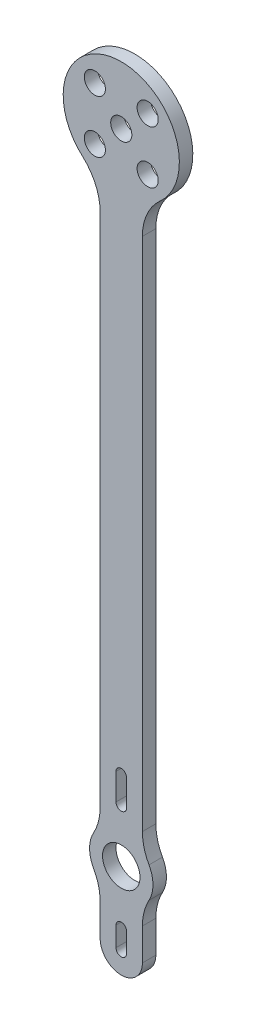
ISO-10303-21;
HEADER;
FILE_DESCRIPTION(('STEP AP214'),'2;1');
FILE_NAME('part.step','',(''),(''),'','','');
FILE_SCHEMA(('AUTOMOTIVE_DESIGN { 1 0 10303 214 1 1 1 1 }'));
ENDSEC;
DATA;
#1=APPLICATION_CONTEXT('core data for automotive mechanical design processes');
#2=APPLICATION_PROTOCOL_DEFINITION('international standard','automotive_design',2000,#1);
#3=PRODUCT_CONTEXT('',#1,'mechanical');
#4=PRODUCT('Part','Part','',(#3));
#5=PRODUCT_RELATED_PRODUCT_CATEGORY('part','',(#4));
#6=PRODUCT_DEFINITION_FORMATION('','',#4);
#7=PRODUCT_DEFINITION_CONTEXT('part definition',#1,'design');
#8=PRODUCT_DEFINITION('design','',#6,#7);
#9=PRODUCT_DEFINITION_SHAPE('','',#8);
#10=(LENGTH_UNIT() NAMED_UNIT(*) SI_UNIT(.MILLI.,.METRE.));
#11=(NAMED_UNIT(*) PLANE_ANGLE_UNIT() SI_UNIT($,.RADIAN.));
#12=(NAMED_UNIT(*) SI_UNIT($,.STERADIAN.) SOLID_ANGLE_UNIT());
#13=UNCERTAINTY_MEASURE_WITH_UNIT(LENGTH_MEASURE(1.E-05),#10,'distance_accuracy_value','');
#14=(GEOMETRIC_REPRESENTATION_CONTEXT(3) GLOBAL_UNCERTAINTY_ASSIGNED_CONTEXT((#13)) GLOBAL_UNIT_ASSIGNED_CONTEXT((#10,
#11,#12)) REPRESENTATION_CONTEXT('',''));
#15=CARTESIAN_POINT('',(0.,0.,0.));
#16=DIRECTION('',(0.,0.,1.));
#17=DIRECTION('',(1.,0.,0.));
#18=AXIS2_PLACEMENT_3D('',#15,#16,#17);
#19=CARTESIAN_POINT('',(0.,-13.8,2.55));
#20=DIRECTION('',(0.,0.,1.));
#21=DIRECTION('',(1.,0.,0.));
#22=AXIS2_PLACEMENT_3D('',#19,#20,#21);
#23=PLANE('',#22);
#24=CARTESIAN_POINT('',(5.0000000000001,116.,2.55));
#25=DIRECTION('',(0.,0.,1.));
#26=DIRECTION('',(1.,0.,0.));
#27=AXIS2_PLACEMENT_3D('',#24,#25,#26);
#28=CIRCLE('',#27,2.);
#29=CARTESIAN_POINT('',(7.00000000000011,116.,2.55));
#30=VERTEX_POINT('',#29);
#31=EDGE_CURVE('E713',#30,#30,#28,.T.);
#32=ORIENTED_EDGE('',*,*,#31,.F.);
#33=EDGE_LOOP('',(#32));
#34=FACE_BOUND('',#33,.T.);
#35=DIRECTION('',(0.,-1.,0.));
#36=VECTOR('',#35,1.);
#37=CARTESIAN_POINT('',(-0.999999999999998,15.1,2.55));
#38=LINE('',#37,#36);
#39=CARTESIAN_POINT('',(-0.999999999999998,15.1,2.55));
#40=VERTEX_POINT('',#39);
#41=CARTESIAN_POINT('',(-0.999999999999998,10.1,2.55));
#42=VERTEX_POINT('',#41);
#43=EDGE_CURVE('E192',#40,#42,#38,.T.);
#44=ORIENTED_EDGE('',*,*,#43,.F.);
#45=CARTESIAN_POINT('',(0.,15.1,2.55));
#46=DIRECTION('',(0.,0.,1.));
#47=DIRECTION('',(1.,0.,0.));
#48=AXIS2_PLACEMENT_3D('',#45,#46,#47);
#49=CIRCLE('',#48,0.999999999999998);
#50=CARTESIAN_POINT('',(0.999999999999998,15.1,2.55));
#51=VERTEX_POINT('',#50);
#52=EDGE_CURVE('E184',#51,#40,#49,.T.);
#53=ORIENTED_EDGE('',*,*,#52,.F.);
#54=DIRECTION('',(0.,1.,0.));
#55=VECTOR('',#54,1.);
#56=CARTESIAN_POINT('',(0.999999999999998,15.1,2.55));
#57=LINE('',#56,#55);
#58=CARTESIAN_POINT('',(0.999999999999998,10.1,2.55));
#59=VERTEX_POINT('',#58);
#60=EDGE_CURVE('E207',#59,#51,#57,.T.);
#61=ORIENTED_EDGE('',*,*,#60,.F.);
#62=CARTESIAN_POINT('',(0.,10.1,2.55));
#63=DIRECTION('',(0.,0.,1.));
#64=DIRECTION('',(1.,0.,0.));
#65=AXIS2_PLACEMENT_3D('',#62,#63,#64);
#66=CIRCLE('',#65,0.999999999999998);
#67=EDGE_CURVE('E205',#42,#59,#66,.T.);
#68=ORIENTED_EDGE('',*,*,#67,.F.);
#69=EDGE_LOOP('',(#44,#53,#61,#68));
#70=FACE_BOUND('',#69,.T.);
#71=CARTESIAN_POINT('',(-5.,126.,2.55));
#72=DIRECTION('',(0.,0.,1.));
#73=DIRECTION('',(1.,0.,0.));
#74=AXIS2_PLACEMENT_3D('',#71,#72,#73);
#75=CIRCLE('',#74,2.);
#76=CARTESIAN_POINT('',(-3.,126.,2.55));
#77=VERTEX_POINT('',#76);
#78=EDGE_CURVE('E254',#77,#77,#75,.T.);
#79=ORIENTED_EDGE('',*,*,#78,.F.);
#80=EDGE_LOOP('',(#79));
#81=FACE_BOUND('',#80,.T.);
#82=CARTESIAN_POINT('',(0.,0.,2.55));
#83=DIRECTION('',(0.,0.,1.));
#84=DIRECTION('',(1.,0.,0.));
#85=AXIS2_PLACEMENT_3D('',#82,#83,#84);
#86=CIRCLE('',#85,3.55);
#87=CARTESIAN_POINT('',(3.55,0.,2.55));
#88=VERTEX_POINT('',#87);
#89=EDGE_CURVE('E266',#88,#88,#86,.T.);
#90=ORIENTED_EDGE('',*,*,#89,.F.);
#91=EDGE_LOOP('',(#90));
#92=FACE_BOUND('',#91,.T.);
#93=CARTESIAN_POINT('',(0.,-13.8,2.55));
#94=DIRECTION('',(0.,0.,1.));
#95=DIRECTION('',(1.,0.,0.));
#96=AXIS2_PLACEMENT_3D('',#93,#94,#95);
#97=CIRCLE('',#96,4.);
#98=CARTESIAN_POINT('',(-4.,-13.8,2.55));
#99=VERTEX_POINT('',#98);
#100=CARTESIAN_POINT('',(4.,-13.8,2.55));
#101=VERTEX_POINT('',#100);
#102=EDGE_CURVE('E272',#99,#101,#97,.T.);
#103=ORIENTED_EDGE('',*,*,#102,.T.);
#104=DIRECTION('',(0.,1.,0.));
#105=VECTOR('',#104,1.);
#106=CARTESIAN_POINT('',(4.,-7.74596669241483,2.55));
#107=LINE('',#106,#105);
#108=CARTESIAN_POINT('',(4.,-7.74596669241483,2.55));
#109=VERTEX_POINT('',#108);
#110=EDGE_CURVE('E275',#101,#109,#107,.T.);
#111=ORIENTED_EDGE('',*,*,#110,.T.);
#112=CARTESIAN_POINT('',(14.,-7.74596669241483,2.55));
#113=DIRECTION('',(0.,0.,-1.));
#114=DIRECTION('',(1.,0.,0.));
#115=AXIS2_PLACEMENT_3D('',#112,#113,#114);
#116=CIRCLE('',#115,10.);
#117=CARTESIAN_POINT('',(5.25,-2.90473750965556,2.55));
#118=VERTEX_POINT('',#117);
#119=EDGE_CURVE('E278',#109,#118,#116,.T.);
#120=ORIENTED_EDGE('',*,*,#119,.T.);
#121=CARTESIAN_POINT('',(0.,0.,2.55));
#122=DIRECTION('',(0.,0.,1.));
#123=DIRECTION('',(1.,0.,0.));
#124=AXIS2_PLACEMENT_3D('',#121,#122,#123);
#125=CIRCLE('',#124,6.);
#126=CARTESIAN_POINT('',(5.25,2.90473750965556,2.55));
#127=VERTEX_POINT('',#126);
#128=EDGE_CURVE('E280',#118,#127,#125,.T.);
#129=ORIENTED_EDGE('',*,*,#128,.T.);
#130=CARTESIAN_POINT('',(14.,7.74596669241483,2.55));
#131=DIRECTION('',(0.,0.,-1.));
#132=DIRECTION('',(1.,0.,0.));
#133=AXIS2_PLACEMENT_3D('',#130,#131,#132);
#134=CIRCLE('',#133,10.);
#135=CARTESIAN_POINT('',(4.,7.74596669241483,2.55));
#136=VERTEX_POINT('',#135);
#137=EDGE_CURVE('E282',#127,#136,#134,.T.);
#138=ORIENTED_EDGE('',*,*,#137,.T.);
#139=DIRECTION('',(0.,1.,0.));
#140=VECTOR('',#139,1.);
#141=CARTESIAN_POINT('',(3.99999999999999,105.347524157501,2.55));
#142=LINE('',#141,#140);
#143=CARTESIAN_POINT('',(3.99999999999999,105.347524157501,2.55));
#144=VERTEX_POINT('',#143);
#145=EDGE_CURVE('E284',#136,#144,#142,.T.);
#146=ORIENTED_EDGE('',*,*,#145,.T.);
#147=CARTESIAN_POINT('',(14.,105.347524157501,2.55));
#148=DIRECTION('',(0.,0.,-1.));
#149=DIRECTION('',(-1.,0.,0.));
#150=AXIS2_PLACEMENT_3D('',#147,#148,#149);
#151=CIRCLE('',#150,10.);
#152=CARTESIAN_POINT('',(7.33333333333333,112.801084082501,2.55));
#153=VERTEX_POINT('',#152);
#154=EDGE_CURVE('E286',#144,#153,#151,.T.);
#155=ORIENTED_EDGE('',*,*,#154,.T.);
#156=CARTESIAN_POINT('',(0.,121.,2.55));
#157=DIRECTION('',(0.,0.,1.));
#158=DIRECTION('',(1.,0.,0.));
#159=AXIS2_PLACEMENT_3D('',#156,#157,#158);
#160=CIRCLE('',#159,11.);
#161=CARTESIAN_POINT('',(-7.33333333333335,112.801084082501,2.55));
#162=VERTEX_POINT('',#161);
#163=EDGE_CURVE('E288',#153,#162,#160,.T.);
#164=ORIENTED_EDGE('',*,*,#163,.T.);
#165=CARTESIAN_POINT('',(-14.,105.347524157501,2.55));
#166=DIRECTION('',(0.,0.,-1.));
#167=DIRECTION('',(1.,0.,0.));
#168=AXIS2_PLACEMENT_3D('',#165,#166,#167);
#169=CIRCLE('',#168,10.);
#170=CARTESIAN_POINT('',(-4.00000000000001,105.347524157501,2.55));
#171=VERTEX_POINT('',#170);
#172=EDGE_CURVE('E290',#162,#171,#169,.T.);
#173=ORIENTED_EDGE('',*,*,#172,.T.);
#174=DIRECTION('',(0.,-1.,0.));
#175=VECTOR('',#174,1.);
#176=CARTESIAN_POINT('',(-4.00000000000001,105.347524157501,2.55));
#177=LINE('',#176,#175);
#178=CARTESIAN_POINT('',(-4.,7.74596669241484,2.55));
#179=VERTEX_POINT('',#178);
#180=EDGE_CURVE('E292',#171,#179,#177,.T.);
#181=ORIENTED_EDGE('',*,*,#180,.T.);
#182=CARTESIAN_POINT('',(-14.,7.74596669241484,2.55));
#183=DIRECTION('',(0.,0.,-1.));
#184=DIRECTION('',(1.,0.,0.));
#185=AXIS2_PLACEMENT_3D('',#182,#183,#184);
#186=CIRCLE('',#185,10.);
#187=CARTESIAN_POINT('',(-5.25,2.90473750965556,2.55));
#188=VERTEX_POINT('',#187);
#189=EDGE_CURVE('E294',#179,#188,#186,.T.);
#190=ORIENTED_EDGE('',*,*,#189,.T.);
#191=CARTESIAN_POINT('',(0.,0.,2.55));
#192=DIRECTION('',(0.,0.,1.));
#193=DIRECTION('',(1.,0.,0.));
#194=AXIS2_PLACEMENT_3D('',#191,#192,#193);
#195=CIRCLE('',#194,6.);
#196=CARTESIAN_POINT('',(-5.25,-2.90473750965556,2.55));
#197=VERTEX_POINT('',#196);
#198=EDGE_CURVE('E296',#188,#197,#195,.T.);
#199=ORIENTED_EDGE('',*,*,#198,.T.);
#200=CARTESIAN_POINT('',(-14.,-7.74596669241484,2.55));
#201=DIRECTION('',(0.,0.,-1.));
#202=DIRECTION('',(-1.,0.,0.));
#203=AXIS2_PLACEMENT_3D('',#200,#201,#202);
#204=CIRCLE('',#203,10.);
#205=CARTESIAN_POINT('',(-4.,-7.74596669241484,2.55));
#206=VERTEX_POINT('',#205);
#207=EDGE_CURVE('E298',#197,#206,#204,.T.);
#208=ORIENTED_EDGE('',*,*,#207,.T.);
#209=DIRECTION('',(0.,-1.,0.));
#210=VECTOR('',#209,1.);
#211=CARTESIAN_POINT('',(-4.,-7.74596669241484,2.55));
#212=LINE('',#211,#210);
#213=EDGE_CURVE('E300',#206,#99,#212,.T.);
#214=ORIENTED_EDGE('',*,*,#213,.T.);
#215=EDGE_LOOP('',(#103,#111,#120,#129,#138,#146,#155,#164,#173,#181,#190,#199,#208,#214));
#216=FACE_BOUND('',#215,.T.);
#217=CARTESIAN_POINT('',(0.,121.,2.55));
#218=DIRECTION('',(0.,0.,1.));
#219=DIRECTION('',(1.,0.,0.));
#220=AXIS2_PLACEMENT_3D('',#217,#218,#219);
#221=CIRCLE('',#220,2.);
#222=CARTESIAN_POINT('',(2.,121.,2.55));
#223=VERTEX_POINT('',#222);
#224=EDGE_CURVE('E260',#223,#223,#221,.T.);
#225=ORIENTED_EDGE('',*,*,#224,.F.);
#226=EDGE_LOOP('',(#225));
#227=FACE_BOUND('',#226,.T.);
#228=DIRECTION('',(0.,-1.,0.));
#229=VECTOR('',#228,1.);
#230=CARTESIAN_POINT('',(-0.999999999999998,-10.1,2.55));
#231=LINE('',#230,#229);
#232=CARTESIAN_POINT('',(-0.999999999999998,-10.1,2.55));
#233=VERTEX_POINT('',#232);
#234=CARTESIAN_POINT('',(-0.999999999999998,-13.8,2.55));
#235=VERTEX_POINT('',#234);
#236=EDGE_CURVE('E225',#233,#235,#231,.T.);
#237=ORIENTED_EDGE('',*,*,#236,.F.);
#238=CARTESIAN_POINT('',(0.,-10.1,2.55));
#239=DIRECTION('',(0.,0.,1.));
#240=DIRECTION('',(1.,0.,0.));
#241=AXIS2_PLACEMENT_3D('',#238,#239,#240);
#242=CIRCLE('',#241,0.999999999999998);
#243=CARTESIAN_POINT('',(0.999999999999998,-10.1,2.55));
#244=VERTEX_POINT('',#243);
#245=EDGE_CURVE('E223',#244,#233,#242,.T.);
#246=ORIENTED_EDGE('',*,*,#245,.F.);
#247=DIRECTION('',(0.,1.,0.));
#248=VECTOR('',#247,1.);
#249=CARTESIAN_POINT('',(0.999999999999998,-10.1,2.55));
#250=LINE('',#249,#248);
#251=CARTESIAN_POINT('',(0.999999999999998,-13.8,2.55));
#252=VERTEX_POINT('',#251);
#253=EDGE_CURVE('E231',#252,#244,#250,.T.);
#254=ORIENTED_EDGE('',*,*,#253,.F.);
#255=CARTESIAN_POINT('',(0.,-13.8,2.55));
#256=DIRECTION('',(0.,0.,1.));
#257=DIRECTION('',(1.,0.,0.));
#258=AXIS2_PLACEMENT_3D('',#255,#256,#257);
#259=CIRCLE('',#258,0.999999999999998);
#260=EDGE_CURVE('E228',#235,#252,#259,.T.);
#261=ORIENTED_EDGE('',*,*,#260,.F.);
#262=EDGE_LOOP('',(#237,#246,#254,#261));
#263=FACE_BOUND('',#262,.T.);
#264=CARTESIAN_POINT('',(5.,126.,2.55));
#265=DIRECTION('',(0.,0.,1.));
#266=DIRECTION('',(1.,0.,0.));
#267=AXIS2_PLACEMENT_3D('',#264,#265,#266);
#268=CIRCLE('',#267,2.);
#269=CARTESIAN_POINT('',(7.,126.,2.55));
#270=VERTEX_POINT('',#269);
#271=EDGE_CURVE('E213',#270,#270,#268,.T.);
#272=ORIENTED_EDGE('',*,*,#271,.F.);
#273=EDGE_LOOP('',(#272));
#274=FACE_BOUND('',#273,.T.);
#275=CARTESIAN_POINT('',(-4.9999999999999,116.,2.55));
#276=DIRECTION('',(0.,0.,1.));
#277=DIRECTION('',(1.,0.,0.));
#278=AXIS2_PLACEMENT_3D('',#275,#276,#277);
#279=CIRCLE('',#278,2.);
#280=CARTESIAN_POINT('',(-2.99999999999989,116.,2.55));
#281=VERTEX_POINT('',#280);
#282=EDGE_CURVE('E704',#281,#281,#279,.T.);
#283=ORIENTED_EDGE('',*,*,#282,.F.);
#284=EDGE_LOOP('',(#283));
#285=FACE_BOUND('',#284,.T.);
#286=ADVANCED_FACE('F35',(#34,#70,#81,#92,#216,#227,#263,#274,#285),#23,.T.);
#287=CARTESIAN_POINT('',(0.,-13.8,0.));
#288=DIRECTION('',(0.,0.,1.));
#289=DIRECTION('',(1.,0.,0.));
#290=AXIS2_PLACEMENT_3D('',#287,#288,#289);
#291=PLANE('',#290);
#292=CARTESIAN_POINT('',(5.0000000000001,116.,0.));
#293=DIRECTION('',(0.,0.,1.));
#294=DIRECTION('',(1.,0.,0.));
#295=AXIS2_PLACEMENT_3D('',#292,#293,#294);
#296=CIRCLE('',#295,2.);
#297=CARTESIAN_POINT('',(7.00000000000011,116.,0.));
#298=VERTEX_POINT('',#297);
#299=EDGE_CURVE('E710',#298,#298,#296,.T.);
#300=ORIENTED_EDGE('',*,*,#299,.T.);
#301=EDGE_LOOP('',(#300));
#302=FACE_BOUND('',#301,.T.);
#303=CARTESIAN_POINT('',(0.,15.1,0.));
#304=DIRECTION('',(0.,0.,1.));
#305=DIRECTION('',(1.,0.,0.));
#306=AXIS2_PLACEMENT_3D('',#303,#304,#305);
#307=CIRCLE('',#306,0.999999999999998);
#308=CARTESIAN_POINT('',(0.999999999999998,15.1,0.));
#309=VERTEX_POINT('',#308);
#310=CARTESIAN_POINT('',(-0.999999999999998,15.1,0.));
#311=VERTEX_POINT('',#310);
#312=EDGE_CURVE('E58',#309,#311,#307,.T.);
#313=ORIENTED_EDGE('',*,*,#312,.T.);
#314=DIRECTION('',(0.,-1.,0.));
#315=VECTOR('',#314,1.);
#316=CARTESIAN_POINT('',(-0.999999999999998,15.1,0.));
#317=LINE('',#316,#315);
#318=CARTESIAN_POINT('',(-0.999999999999998,10.1,0.));
#319=VERTEX_POINT('',#318);
#320=EDGE_CURVE('E199',#311,#319,#317,.T.);
#321=ORIENTED_EDGE('',*,*,#320,.T.);
#322=CARTESIAN_POINT('',(0.,10.1,0.));
#323=DIRECTION('',(0.,0.,1.));
#324=DIRECTION('',(1.,0.,0.));
#325=AXIS2_PLACEMENT_3D('',#322,#323,#324);
#326=CIRCLE('',#325,0.999999999999998);
#327=CARTESIAN_POINT('',(0.999999999999998,10.1,0.));
#328=VERTEX_POINT('',#327);
#329=EDGE_CURVE('E215',#319,#328,#326,.T.);
#330=ORIENTED_EDGE('',*,*,#329,.T.);
#331=DIRECTION('',(0.,1.,0.));
#332=VECTOR('',#331,1.);
#333=CARTESIAN_POINT('',(0.999999999999998,15.1,0.));
#334=LINE('',#333,#332);
#335=EDGE_CURVE('E193',#328,#309,#334,.T.);
#336=ORIENTED_EDGE('',*,*,#335,.T.);
#337=EDGE_LOOP('',(#313,#321,#330,#336));
#338=FACE_BOUND('',#337,.T.);
#339=CARTESIAN_POINT('',(-5.,126.,0.));
#340=DIRECTION('',(0.,0.,1.));
#341=DIRECTION('',(1.,0.,0.));
#342=AXIS2_PLACEMENT_3D('',#339,#340,#341);
#343=CIRCLE('',#342,2.);
#344=CARTESIAN_POINT('',(-3.,126.,0.));
#345=VERTEX_POINT('',#344);
#346=EDGE_CURVE('E253',#345,#345,#343,.T.);
#347=ORIENTED_EDGE('',*,*,#346,.T.);
#348=EDGE_LOOP('',(#347));
#349=FACE_BOUND('',#348,.T.);
#350=CARTESIAN_POINT('',(0.,0.,0.));
#351=DIRECTION('',(0.,0.,1.));
#352=DIRECTION('',(1.,0.,0.));
#353=AXIS2_PLACEMENT_3D('',#350,#351,#352);
#354=CIRCLE('',#353,3.55);
#355=CARTESIAN_POINT('',(3.55,0.,0.));
#356=VERTEX_POINT('',#355);
#357=EDGE_CURVE('E263',#356,#356,#354,.T.);
#358=ORIENTED_EDGE('',*,*,#357,.T.);
#359=EDGE_LOOP('',(#358));
#360=FACE_BOUND('',#359,.T.);
#361=CARTESIAN_POINT('',(0.,-13.8,0.));
#362=DIRECTION('',(0.,0.,1.));
#363=DIRECTION('',(1.,0.,0.));
#364=AXIS2_PLACEMENT_3D('',#361,#362,#363);
#365=CIRCLE('',#364,4.);
#366=CARTESIAN_POINT('',(-4.,-13.8,0.));
#367=VERTEX_POINT('',#366);
#368=CARTESIAN_POINT('',(4.,-13.8,0.));
#369=VERTEX_POINT('',#368);
#370=EDGE_CURVE('E269',#367,#369,#365,.T.);
#371=ORIENTED_EDGE('',*,*,#370,.F.);
#372=DIRECTION('',(0.,-1.,0.));
#373=VECTOR('',#372,1.);
#374=CARTESIAN_POINT('',(-4.,-7.74596669241484,0.));
#375=LINE('',#374,#373);
#376=CARTESIAN_POINT('',(-4.,-7.74596669241484,0.));
#377=VERTEX_POINT('',#376);
#378=EDGE_CURVE('E276',#377,#367,#375,.T.);
#379=ORIENTED_EDGE('',*,*,#378,.F.);
#380=CARTESIAN_POINT('',(-14.,-7.74596669241484,0.));
#381=DIRECTION('',(0.,0.,-1.));
#382=DIRECTION('',(-1.,0.,0.));
#383=AXIS2_PLACEMENT_3D('',#380,#381,#382);
#384=CIRCLE('',#383,10.);
#385=CARTESIAN_POINT('',(-5.25,-2.90473750965556,0.));
#386=VERTEX_POINT('',#385);
#387=EDGE_CURVE('E327',#386,#377,#384,.T.);
#388=ORIENTED_EDGE('',*,*,#387,.F.);
#389=CARTESIAN_POINT('',(0.,0.,0.));
#390=DIRECTION('',(0.,0.,1.));
#391=DIRECTION('',(1.,0.,0.));
#392=AXIS2_PLACEMENT_3D('',#389,#390,#391);
#393=CIRCLE('',#392,6.);
#394=CARTESIAN_POINT('',(-5.25,2.90473750965556,0.));
#395=VERTEX_POINT('',#394);
#396=EDGE_CURVE('E325',#395,#386,#393,.T.);
#397=ORIENTED_EDGE('',*,*,#396,.F.);
#398=CARTESIAN_POINT('',(-14.,7.74596669241484,0.));
#399=DIRECTION('',(0.,0.,-1.));
#400=DIRECTION('',(1.,0.,0.));
#401=AXIS2_PLACEMENT_3D('',#398,#399,#400);
#402=CIRCLE('',#401,10.);
#403=CARTESIAN_POINT('',(-4.,7.74596669241484,0.));
#404=VERTEX_POINT('',#403);
#405=EDGE_CURVE('E323',#404,#395,#402,.T.);
#406=ORIENTED_EDGE('',*,*,#405,.F.);
#407=DIRECTION('',(0.,-1.,0.));
#408=VECTOR('',#407,1.);
#409=CARTESIAN_POINT('',(-4.00000000000001,105.347524157501,0.));
#410=LINE('',#409,#408);
#411=CARTESIAN_POINT('',(-4.00000000000001,105.347524157501,0.));
#412=VERTEX_POINT('',#411);
#413=EDGE_CURVE('E321',#412,#404,#410,.T.);
#414=ORIENTED_EDGE('',*,*,#413,.F.);
#415=CARTESIAN_POINT('',(-14.,105.347524157501,0.));
#416=DIRECTION('',(0.,0.,-1.));
#417=DIRECTION('',(1.,0.,0.));
#418=AXIS2_PLACEMENT_3D('',#415,#416,#417);
#419=CIRCLE('',#418,10.);
#420=CARTESIAN_POINT('',(-7.33333333333335,112.801084082501,0.));
#421=VERTEX_POINT('',#420);
#422=EDGE_CURVE('E319',#421,#412,#419,.T.);
#423=ORIENTED_EDGE('',*,*,#422,.F.);
#424=CARTESIAN_POINT('',(0.,121.,0.));
#425=DIRECTION('',(0.,0.,1.));
#426=DIRECTION('',(1.,0.,0.));
#427=AXIS2_PLACEMENT_3D('',#424,#425,#426);
#428=CIRCLE('',#427,11.);
#429=CARTESIAN_POINT('',(7.33333333333333,112.801084082501,0.));
#430=VERTEX_POINT('',#429);
#431=EDGE_CURVE('E317',#430,#421,#428,.T.);
#432=ORIENTED_EDGE('',*,*,#431,.F.);
#433=CARTESIAN_POINT('',(14.,105.347524157501,0.));
#434=DIRECTION('',(0.,0.,-1.));
#435=DIRECTION('',(-1.,0.,0.));
#436=AXIS2_PLACEMENT_3D('',#433,#434,#435);
#437=CIRCLE('',#436,10.);
#438=CARTESIAN_POINT('',(3.99999999999999,105.347524157501,0.));
#439=VERTEX_POINT('',#438);
#440=EDGE_CURVE('E315',#439,#430,#437,.T.);
#441=ORIENTED_EDGE('',*,*,#440,.F.);
#442=DIRECTION('',(0.,1.,0.));
#443=VECTOR('',#442,1.);
#444=CARTESIAN_POINT('',(3.99999999999999,105.347524157501,0.));
#445=LINE('',#444,#443);
#446=CARTESIAN_POINT('',(4.,7.74596669241483,0.));
#447=VERTEX_POINT('',#446);
#448=EDGE_CURVE('E313',#447,#439,#445,.T.);
#449=ORIENTED_EDGE('',*,*,#448,.F.);
#450=CARTESIAN_POINT('',(14.,7.74596669241483,0.));
#451=DIRECTION('',(0.,0.,-1.));
#452=DIRECTION('',(1.,0.,0.));
#453=AXIS2_PLACEMENT_3D('',#450,#451,#452);
#454=CIRCLE('',#453,10.);
#455=CARTESIAN_POINT('',(5.25,2.90473750965556,0.));
#456=VERTEX_POINT('',#455);
#457=EDGE_CURVE('E311',#456,#447,#454,.T.);
#458=ORIENTED_EDGE('',*,*,#457,.F.);
#459=CARTESIAN_POINT('',(0.,0.,0.));
#460=DIRECTION('',(0.,0.,1.));
#461=DIRECTION('',(1.,0.,0.));
#462=AXIS2_PLACEMENT_3D('',#459,#460,#461);
#463=CIRCLE('',#462,6.);
#464=CARTESIAN_POINT('',(5.25,-2.90473750965556,0.));
#465=VERTEX_POINT('',#464);
#466=EDGE_CURVE('E309',#465,#456,#463,.T.);
#467=ORIENTED_EDGE('',*,*,#466,.F.);
#468=CARTESIAN_POINT('',(14.,-7.74596669241483,0.));
#469=DIRECTION('',(0.,0.,-1.));
#470=DIRECTION('',(1.,0.,0.));
#471=AXIS2_PLACEMENT_3D('',#468,#469,#470);
#472=CIRCLE('',#471,10.);
#473=CARTESIAN_POINT('',(4.,-7.74596669241483,0.));
#474=VERTEX_POINT('',#473);
#475=EDGE_CURVE('E307',#474,#465,#472,.T.);
#476=ORIENTED_EDGE('',*,*,#475,.F.);
#477=DIRECTION('',(0.,1.,0.));
#478=VECTOR('',#477,1.);
#479=CARTESIAN_POINT('',(4.,-7.74596669241483,0.));
#480=LINE('',#479,#478);
#481=EDGE_CURVE('E305',#369,#474,#480,.T.);
#482=ORIENTED_EDGE('',*,*,#481,.F.);
#483=EDGE_LOOP('',(#371,#379,#388,#397,#406,#414,#423,#432,#441,#449,#458,#467,#476,#482));
#484=FACE_BOUND('',#483,.T.);
#485=CARTESIAN_POINT('',(0.,121.,0.));
#486=DIRECTION('',(0.,0.,1.));
#487=DIRECTION('',(1.,0.,0.));
#488=AXIS2_PLACEMENT_3D('',#485,#486,#487);
#489=CIRCLE('',#488,2.);
#490=CARTESIAN_POINT('',(2.,121.,0.));
#491=VERTEX_POINT('',#490);
#492=EDGE_CURVE('E257',#491,#491,#489,.T.);
#493=ORIENTED_EDGE('',*,*,#492,.T.);
#494=EDGE_LOOP('',(#493));
#495=FACE_BOUND('',#494,.T.);
#496=CARTESIAN_POINT('',(0.,-10.1,0.));
#497=DIRECTION('',(0.,0.,1.));
#498=DIRECTION('',(1.,0.,0.));
#499=AXIS2_PLACEMENT_3D('',#496,#497,#498);
#500=CIRCLE('',#499,0.999999999999998);
#501=CARTESIAN_POINT('',(0.999999999999998,-10.1,0.));
#502=VERTEX_POINT('',#501);
#503=CARTESIAN_POINT('',(-0.999999999999998,-10.1,0.));
#504=VERTEX_POINT('',#503);
#505=EDGE_CURVE('E200',#502,#504,#500,.T.);
#506=ORIENTED_EDGE('',*,*,#505,.T.);
#507=DIRECTION('',(0.,-1.,0.));
#508=VECTOR('',#507,1.);
#509=CARTESIAN_POINT('',(-0.999999999999998,-10.1,0.));
#510=LINE('',#509,#508);
#511=CARTESIAN_POINT('',(-0.999999999999998,-13.8,0.));
#512=VERTEX_POINT('',#511);
#513=EDGE_CURVE('E236',#504,#512,#510,.T.);
#514=ORIENTED_EDGE('',*,*,#513,.T.);
#515=CARTESIAN_POINT('',(0.,-13.8,0.));
#516=DIRECTION('',(0.,0.,1.));
#517=DIRECTION('',(1.,0.,0.));
#518=AXIS2_PLACEMENT_3D('',#515,#516,#517);
#519=CIRCLE('',#518,0.999999999999998);
#520=CARTESIAN_POINT('',(0.999999999999998,-13.8,0.));
#521=VERTEX_POINT('',#520);
#522=EDGE_CURVE('E239',#512,#521,#519,.T.);
#523=ORIENTED_EDGE('',*,*,#522,.T.);
#524=DIRECTION('',(0.,1.,0.));
#525=VECTOR('',#524,1.);
#526=CARTESIAN_POINT('',(0.999999999999998,-10.1,0.));
#527=LINE('',#526,#525);
#528=EDGE_CURVE('E226',#521,#502,#527,.T.);
#529=ORIENTED_EDGE('',*,*,#528,.T.);
#530=EDGE_LOOP('',(#506,#514,#523,#529));
#531=FACE_BOUND('',#530,.T.);
#532=CARTESIAN_POINT('',(5.,126.,0.));
#533=DIRECTION('',(0.,0.,1.));
#534=DIRECTION('',(1.,0.,0.));
#535=AXIS2_PLACEMENT_3D('',#532,#533,#534);
#536=CIRCLE('',#535,2.);
#537=CARTESIAN_POINT('',(7.,126.,0.));
#538=VERTEX_POINT('',#537);
#539=EDGE_CURVE('E716',#538,#538,#536,.T.);
#540=ORIENTED_EDGE('',*,*,#539,.T.);
#541=EDGE_LOOP('',(#540));
#542=FACE_BOUND('',#541,.T.);
#543=CARTESIAN_POINT('',(-4.9999999999999,116.,0.));
#544=DIRECTION('',(0.,0.,1.));
#545=DIRECTION('',(1.,0.,0.));
#546=AXIS2_PLACEMENT_3D('',#543,#544,#545);
#547=CIRCLE('',#546,2.);
#548=CARTESIAN_POINT('',(-2.99999999999989,116.,0.));
#549=VERTEX_POINT('',#548);
#550=EDGE_CURVE('E707',#549,#549,#547,.T.);
#551=ORIENTED_EDGE('',*,*,#550,.T.);
#552=EDGE_LOOP('',(#551));
#553=FACE_BOUND('',#552,.T.);
#554=ADVANCED_FACE('F375',(#302,#338,#349,#360,#484,#495,#531,#542,#553),#291,.F.);
#555=CARTESIAN_POINT('',(0.,-13.8,2.55));
#556=DIRECTION('',(0.,0.,-1.));
#557=DIRECTION('',(-1.,0.,0.));
#558=AXIS2_PLACEMENT_3D('',#555,#556,#557);
#559=CYLINDRICAL_SURFACE('',#558,4.);
#560=ORIENTED_EDGE('',*,*,#370,.T.);
#561=DIRECTION('',(0.,0.,-1.));
#562=VECTOR('',#561,1.);
#563=CARTESIAN_POINT('',(4.,-13.8,2.55));
#564=LINE('',#563,#562);
#565=EDGE_CURVE('E11',#101,#369,#564,.T.);
#566=ORIENTED_EDGE('',*,*,#565,.F.);
#567=ORIENTED_EDGE('',*,*,#102,.F.);
#568=DIRECTION('',(0.,0.,-1.));
#569=VECTOR('',#568,1.);
#570=CARTESIAN_POINT('',(-4.,-13.8,2.55));
#571=LINE('',#570,#569);
#572=EDGE_CURVE('E302',#99,#367,#571,.T.);
#573=ORIENTED_EDGE('',*,*,#572,.T.);
#574=EDGE_LOOP('',(#560,#566,#567,#573));
#575=FACE_BOUND('',#574,.T.);
#576=ADVANCED_FACE('F37',(#575),#559,.T.);
#577=CARTESIAN_POINT('',(4.,-7.74596669241483,2.55));
#578=DIRECTION('',(-1.,0.,0.));
#579=DIRECTION('',(0.,-1.,0.));
#580=AXIS2_PLACEMENT_3D('',#577,#578,#579);
#581=PLANE('',#580);
#582=ORIENTED_EDGE('',*,*,#481,.T.);
#583=DIRECTION('',(0.,0.,-1.));
#584=VECTOR('',#583,1.);
#585=CARTESIAN_POINT('',(4.,-7.74596669241483,2.55));
#586=LINE('',#585,#584);
#587=EDGE_CURVE('E43',#109,#474,#586,.T.);
#588=ORIENTED_EDGE('',*,*,#587,.F.);
#589=ORIENTED_EDGE('',*,*,#110,.F.);
#590=ORIENTED_EDGE('',*,*,#565,.T.);
#591=EDGE_LOOP('',(#582,#588,#589,#590));
#592=FACE_BOUND('',#591,.T.);
#593=ADVANCED_FACE('F393',(#592),#581,.F.);
#594=CARTESIAN_POINT('',(14.,-7.74596669241483,2.55));
#595=DIRECTION('',(0.,0.,-1.));
#596=DIRECTION('',(-1.,0.,0.));
#597=AXIS2_PLACEMENT_3D('',#594,#595,#596);
#598=CYLINDRICAL_SURFACE('',#597,10.);
#599=ORIENTED_EDGE('',*,*,#475,.T.);
#600=DIRECTION('',(0.,0.,-1.));
#601=VECTOR('',#600,1.);
#602=CARTESIAN_POINT('',(5.25,-2.90473750965556,2.55));
#603=LINE('',#602,#601);
#604=EDGE_CURVE('E362',#118,#465,#603,.T.);
#605=ORIENTED_EDGE('',*,*,#604,.F.);
#606=ORIENTED_EDGE('',*,*,#119,.F.);
#607=ORIENTED_EDGE('',*,*,#587,.T.);
#608=EDGE_LOOP('',(#599,#605,#606,#607));
#609=FACE_BOUND('',#608,.T.);
#610=ADVANCED_FACE('F369',(#609),#598,.F.);
#611=CARTESIAN_POINT('',(0.,0.,2.55));
#612=DIRECTION('',(0.,0.,-1.));
#613=DIRECTION('',(-1.,0.,0.));
#614=AXIS2_PLACEMENT_3D('',#611,#612,#613);
#615=CYLINDRICAL_SURFACE('',#614,6.);
#616=ORIENTED_EDGE('',*,*,#466,.T.);
#617=DIRECTION('',(0.,0.,-1.));
#618=VECTOR('',#617,1.);
#619=CARTESIAN_POINT('',(5.25,2.90473750965556,2.55));
#620=LINE('',#619,#618);
#621=EDGE_CURVE('E359',#127,#456,#620,.T.);
#622=ORIENTED_EDGE('',*,*,#621,.F.);
#623=ORIENTED_EDGE('',*,*,#128,.F.);
#624=ORIENTED_EDGE('',*,*,#604,.T.);
#625=EDGE_LOOP('',(#616,#622,#623,#624));
#626=FACE_BOUND('',#625,.T.);
#627=ADVANCED_FACE('F381',(#626),#615,.T.);
#628=CARTESIAN_POINT('',(14.,7.74596669241483,2.55));
#629=DIRECTION('',(0.,0.,-1.));
#630=DIRECTION('',(-1.,0.,0.));
#631=AXIS2_PLACEMENT_3D('',#628,#629,#630);
#632=CYLINDRICAL_SURFACE('',#631,10.);
#633=ORIENTED_EDGE('',*,*,#457,.T.);
#634=DIRECTION('',(0.,0.,-1.));
#635=VECTOR('',#634,1.);
#636=CARTESIAN_POINT('',(4.,7.74596669241483,2.55));
#637=LINE('',#636,#635);
#638=EDGE_CURVE('E356',#136,#447,#637,.T.);
#639=ORIENTED_EDGE('',*,*,#638,.F.);
#640=ORIENTED_EDGE('',*,*,#137,.F.);
#641=ORIENTED_EDGE('',*,*,#621,.T.);
#642=EDGE_LOOP('',(#633,#639,#640,#641));
#643=FACE_BOUND('',#642,.T.);
#644=ADVANCED_FACE('F385',(#643),#632,.F.);
#645=CARTESIAN_POINT('',(3.99999999999999,105.347524157501,2.55));
#646=DIRECTION('',(-1.,0.,0.));
#647=DIRECTION('',(0.,-1.,0.));
#648=AXIS2_PLACEMENT_3D('',#645,#646,#647);
#649=PLANE('',#648);
#650=ORIENTED_EDGE('',*,*,#448,.T.);
#651=DIRECTION('',(0.,0.,-1.));
#652=VECTOR('',#651,1.);
#653=CARTESIAN_POINT('',(3.99999999999999,105.347524157501,2.55));
#654=LINE('',#653,#652);
#655=EDGE_CURVE('E353',#144,#439,#654,.T.);
#656=ORIENTED_EDGE('',*,*,#655,.F.);
#657=ORIENTED_EDGE('',*,*,#145,.F.);
#658=ORIENTED_EDGE('',*,*,#638,.T.);
#659=EDGE_LOOP('',(#650,#656,#657,#658));
#660=FACE_BOUND('',#659,.T.);
#661=ADVANCED_FACE('F436',(#660),#649,.F.);
#662=CARTESIAN_POINT('',(14.,105.347524157501,2.55));
#663=DIRECTION('',(0.,0.,-1.));
#664=DIRECTION('',(-1.,0.,0.));
#665=AXIS2_PLACEMENT_3D('',#662,#663,#664);
#666=CYLINDRICAL_SURFACE('',#665,10.);
#667=ORIENTED_EDGE('',*,*,#440,.T.);
#668=DIRECTION('',(0.,0.,-1.));
#669=VECTOR('',#668,1.);
#670=CARTESIAN_POINT('',(7.33333333333333,112.801084082501,2.55));
#671=LINE('',#670,#669);
#672=EDGE_CURVE('E350',#153,#430,#671,.T.);
#673=ORIENTED_EDGE('',*,*,#672,.F.);
#674=ORIENTED_EDGE('',*,*,#154,.F.);
#675=ORIENTED_EDGE('',*,*,#655,.T.);
#676=EDGE_LOOP('',(#667,#673,#674,#675));
#677=FACE_BOUND('',#676,.T.);
#678=ADVANCED_FACE('F434',(#677),#666,.F.);
#679=CARTESIAN_POINT('',(0.,121.,2.55));
#680=DIRECTION('',(0.,0.,-1.));
#681=DIRECTION('',(-1.,0.,0.));
#682=AXIS2_PLACEMENT_3D('',#679,#680,#681);
#683=CYLINDRICAL_SURFACE('',#682,11.);
#684=ORIENTED_EDGE('',*,*,#431,.T.);
#685=DIRECTION('',(0.,0.,-1.));
#686=VECTOR('',#685,1.);
#687=CARTESIAN_POINT('',(-7.33333333333335,112.801084082501,2.55));
#688=LINE('',#687,#686);
#689=EDGE_CURVE('E347',#162,#421,#688,.T.);
#690=ORIENTED_EDGE('',*,*,#689,.F.);
#691=ORIENTED_EDGE('',*,*,#163,.F.);
#692=ORIENTED_EDGE('',*,*,#672,.T.);
#693=EDGE_LOOP('',(#684,#690,#691,#692));
#694=FACE_BOUND('',#693,.T.);
#695=ADVANCED_FACE('F429',(#694),#683,.T.);
#696=CARTESIAN_POINT('',(-14.,105.347524157501,2.55));
#697=DIRECTION('',(0.,0.,-1.));
#698=DIRECTION('',(-1.,0.,0.));
#699=AXIS2_PLACEMENT_3D('',#696,#697,#698);
#700=CYLINDRICAL_SURFACE('',#699,10.);
#701=ORIENTED_EDGE('',*,*,#422,.T.);
#702=DIRECTION('',(0.,0.,-1.));
#703=VECTOR('',#702,1.);
#704=CARTESIAN_POINT('',(-4.00000000000001,105.347524157501,2.55));
#705=LINE('',#704,#703);
#706=EDGE_CURVE('E344',#171,#412,#705,.T.);
#707=ORIENTED_EDGE('',*,*,#706,.F.);
#708=ORIENTED_EDGE('',*,*,#172,.F.);
#709=ORIENTED_EDGE('',*,*,#689,.T.);
#710=EDGE_LOOP('',(#701,#707,#708,#709));
#711=FACE_BOUND('',#710,.T.);
#712=ADVANCED_FACE('F424',(#711),#700,.F.);
#713=CARTESIAN_POINT('',(-4.00000000000001,105.347524157501,2.55));
#714=DIRECTION('',(1.,0.,0.));
#715=DIRECTION('',(0.,1.,0.));
#716=AXIS2_PLACEMENT_3D('',#713,#714,#715);
#717=PLANE('',#716);
#718=ORIENTED_EDGE('',*,*,#413,.T.);
#719=DIRECTION('',(0.,0.,-1.));
#720=VECTOR('',#719,1.);
#721=CARTESIAN_POINT('',(-4.,7.74596669241484,2.55));
#722=LINE('',#721,#720);
#723=EDGE_CURVE('E341',#179,#404,#722,.T.);
#724=ORIENTED_EDGE('',*,*,#723,.F.);
#725=ORIENTED_EDGE('',*,*,#180,.F.);
#726=ORIENTED_EDGE('',*,*,#706,.T.);
#727=EDGE_LOOP('',(#718,#724,#725,#726));
#728=FACE_BOUND('',#727,.T.);
#729=ADVANCED_FACE('F420',(#728),#717,.F.);
#730=CARTESIAN_POINT('',(-14.,7.74596669241484,2.55));
#731=DIRECTION('',(0.,0.,-1.));
#732=DIRECTION('',(-1.,0.,0.));
#733=AXIS2_PLACEMENT_3D('',#730,#731,#732);
#734=CYLINDRICAL_SURFACE('',#733,10.);
#735=ORIENTED_EDGE('',*,*,#405,.T.);
#736=DIRECTION('',(0.,0.,-1.));
#737=VECTOR('',#736,1.);
#738=CARTESIAN_POINT('',(-5.25,2.90473750965556,2.55));
#739=LINE('',#738,#737);
#740=EDGE_CURVE('E338',#188,#395,#739,.T.);
#741=ORIENTED_EDGE('',*,*,#740,.F.);
#742=ORIENTED_EDGE('',*,*,#189,.F.);
#743=ORIENTED_EDGE('',*,*,#723,.T.);
#744=EDGE_LOOP('',(#735,#741,#742,#743));
#745=FACE_BOUND('',#744,.T.);
#746=ADVANCED_FACE('F415',(#745),#734,.F.);
#747=CARTESIAN_POINT('',(0.,0.,2.55));
#748=DIRECTION('',(0.,0.,-1.));
#749=DIRECTION('',(-1.,0.,0.));
#750=AXIS2_PLACEMENT_3D('',#747,#748,#749);
#751=CYLINDRICAL_SURFACE('',#750,6.);
#752=ORIENTED_EDGE('',*,*,#396,.T.);
#753=DIRECTION('',(0.,0.,-1.));
#754=VECTOR('',#753,1.);
#755=CARTESIAN_POINT('',(-5.25,-2.90473750965556,2.55));
#756=LINE('',#755,#754);
#757=EDGE_CURVE('E335',#197,#386,#756,.T.);
#758=ORIENTED_EDGE('',*,*,#757,.F.);
#759=ORIENTED_EDGE('',*,*,#198,.F.);
#760=ORIENTED_EDGE('',*,*,#740,.T.);
#761=EDGE_LOOP('',(#752,#758,#759,#760));
#762=FACE_BOUND('',#761,.T.);
#763=ADVANCED_FACE('F409',(#762),#751,.T.);
#764=CARTESIAN_POINT('',(-14.,-7.74596669241484,2.55));
#765=DIRECTION('',(0.,0.,-1.));
#766=DIRECTION('',(-1.,0.,0.));
#767=AXIS2_PLACEMENT_3D('',#764,#765,#766);
#768=CYLINDRICAL_SURFACE('',#767,10.);
#769=ORIENTED_EDGE('',*,*,#387,.T.);
#770=DIRECTION('',(0.,0.,-1.));
#771=VECTOR('',#770,1.);
#772=CARTESIAN_POINT('',(-4.,-7.74596669241484,2.55));
#773=LINE('',#772,#771);
#774=EDGE_CURVE('E332',#206,#377,#773,.T.);
#775=ORIENTED_EDGE('',*,*,#774,.F.);
#776=ORIENTED_EDGE('',*,*,#207,.F.);
#777=ORIENTED_EDGE('',*,*,#757,.T.);
#778=EDGE_LOOP('',(#769,#775,#776,#777));
#779=FACE_BOUND('',#778,.T.);
#780=ADVANCED_FACE('F405',(#779),#768,.F.);
#781=CARTESIAN_POINT('',(-4.,-7.74596669241484,2.55));
#782=DIRECTION('',(1.,0.,0.));
#783=DIRECTION('',(0.,1.,0.));
#784=AXIS2_PLACEMENT_3D('',#781,#782,#783);
#785=PLANE('',#784);
#786=ORIENTED_EDGE('',*,*,#378,.T.);
#787=ORIENTED_EDGE('',*,*,#572,.F.);
#788=ORIENTED_EDGE('',*,*,#213,.F.);
#789=ORIENTED_EDGE('',*,*,#774,.T.);
#790=EDGE_LOOP('',(#786,#787,#788,#789));
#791=FACE_BOUND('',#790,.T.);
#792=ADVANCED_FACE('F400',(#791),#785,.F.);
#793=CARTESIAN_POINT('',(0.,0.,2.55));
#794=DIRECTION('',(0.,0.,-1.));
#795=DIRECTION('',(-1.,0.,0.));
#796=AXIS2_PLACEMENT_3D('',#793,#794,#795);
#797=CYLINDRICAL_SURFACE('',#796,3.55);
#798=ORIENTED_EDGE('',*,*,#89,.T.);
#799=EDGE_LOOP('',(#798));
#800=FACE_BOUND('',#799,.T.);
#801=ORIENTED_EDGE('',*,*,#357,.F.);
#802=EDGE_LOOP('',(#801));
#803=FACE_BOUND('',#802,.T.);
#804=ADVANCED_FACE('F455',(#800,#803),#797,.F.);
#805=CARTESIAN_POINT('',(0.,121.,2.55));
#806=DIRECTION('',(0.,0.,-1.));
#807=DIRECTION('',(-1.,0.,0.));
#808=AXIS2_PLACEMENT_3D('',#805,#806,#807);
#809=CYLINDRICAL_SURFACE('',#808,2.);
#810=ORIENTED_EDGE('',*,*,#224,.T.);
#811=EDGE_LOOP('',(#810));
#812=FACE_BOUND('',#811,.T.);
#813=ORIENTED_EDGE('',*,*,#492,.F.);
#814=EDGE_LOOP('',(#813));
#815=FACE_BOUND('',#814,.T.);
#816=ADVANCED_FACE('F505',(#812,#815),#809,.F.);
#817=CARTESIAN_POINT('',(-5.,126.,2.55));
#818=DIRECTION('',(0.,0.,-1.));
#819=DIRECTION('',(-1.,0.,0.));
#820=AXIS2_PLACEMENT_3D('',#817,#818,#819);
#821=CYLINDRICAL_SURFACE('',#820,2.);
#822=ORIENTED_EDGE('',*,*,#78,.T.);
#823=EDGE_LOOP('',(#822));
#824=FACE_BOUND('',#823,.T.);
#825=ORIENTED_EDGE('',*,*,#346,.F.);
#826=EDGE_LOOP('',(#825));
#827=FACE_BOUND('',#826,.T.);
#828=ADVANCED_FACE('F512',(#824,#827),#821,.F.);
#829=CARTESIAN_POINT('',(0.,-10.1,2.55));
#830=DIRECTION('',(0.,0.,-1.));
#831=DIRECTION('',(-1.,0.,0.));
#832=AXIS2_PLACEMENT_3D('',#829,#830,#831);
#833=CYLINDRICAL_SURFACE('',#832,0.999999999999998);
#834=ORIENTED_EDGE('',*,*,#505,.F.);
#835=DIRECTION('',(0.,0.,-1.));
#836=VECTOR('',#835,1.);
#837=CARTESIAN_POINT('',(0.999999999999998,-10.1,2.55));
#838=LINE('',#837,#836);
#839=EDGE_CURVE('E233',#244,#502,#838,.T.);
#840=ORIENTED_EDGE('',*,*,#839,.F.);
#841=ORIENTED_EDGE('',*,*,#245,.T.);
#842=DIRECTION('',(0.,0.,-1.));
#843=VECTOR('',#842,1.);
#844=CARTESIAN_POINT('',(-0.999999999999998,-10.1,2.55));
#845=LINE('',#844,#843);
#846=EDGE_CURVE('E250',#233,#504,#845,.T.);
#847=ORIENTED_EDGE('',*,*,#846,.T.);
#848=EDGE_LOOP('',(#834,#840,#841,#847));
#849=FACE_BOUND('',#848,.T.);
#850=ADVANCED_FACE('F519',(#849),#833,.F.);
#851=CARTESIAN_POINT('',(-0.999999999999998,-10.1,2.55));
#852=DIRECTION('',(1.,0.,0.));
#853=DIRECTION('',(0.,0.,-1.));
#854=AXIS2_PLACEMENT_3D('',#851,#852,#853);
#855=PLANE('',#854);
#856=ORIENTED_EDGE('',*,*,#513,.F.);
#857=ORIENTED_EDGE('',*,*,#846,.F.);
#858=ORIENTED_EDGE('',*,*,#236,.T.);
#859=DIRECTION('',(0.,0.,-1.));
#860=VECTOR('',#859,1.);
#861=CARTESIAN_POINT('',(-0.999999999999998,-13.8,2.55));
#862=LINE('',#861,#860);
#863=EDGE_CURVE('E248',#235,#512,#862,.T.);
#864=ORIENTED_EDGE('',*,*,#863,.T.);
#865=EDGE_LOOP('',(#856,#857,#858,#864));
#866=FACE_BOUND('',#865,.T.);
#867=ADVANCED_FACE('F527',(#866),#855,.T.);
#868=CARTESIAN_POINT('',(0.,-13.8,2.55));
#869=DIRECTION('',(0.,0.,-1.));
#870=DIRECTION('',(-1.,0.,0.));
#871=AXIS2_PLACEMENT_3D('',#868,#869,#870);
#872=CYLINDRICAL_SURFACE('',#871,0.999999999999998);
#873=ORIENTED_EDGE('',*,*,#522,.F.);
#874=ORIENTED_EDGE('',*,*,#863,.F.);
#875=ORIENTED_EDGE('',*,*,#260,.T.);
#876=DIRECTION('',(0.,0.,-1.));
#877=VECTOR('',#876,1.);
#878=CARTESIAN_POINT('',(0.999999999999998,-13.8,2.55));
#879=LINE('',#878,#877);
#880=EDGE_CURVE('E246',#252,#521,#879,.T.);
#881=ORIENTED_EDGE('',*,*,#880,.T.);
#882=EDGE_LOOP('',(#873,#874,#875,#881));
#883=FACE_BOUND('',#882,.T.);
#884=ADVANCED_FACE('F535',(#883),#872,.F.);
#885=CARTESIAN_POINT('',(0.999999999999998,-10.1,2.55));
#886=DIRECTION('',(-1.,0.,0.));
#887=DIRECTION('',(0.,0.,1.));
#888=AXIS2_PLACEMENT_3D('',#885,#886,#887);
#889=PLANE('',#888);
#890=ORIENTED_EDGE('',*,*,#528,.F.);
#891=ORIENTED_EDGE('',*,*,#880,.F.);
#892=ORIENTED_EDGE('',*,*,#253,.T.);
#893=ORIENTED_EDGE('',*,*,#839,.T.);
#894=EDGE_LOOP('',(#890,#891,#892,#893));
#895=FACE_BOUND('',#894,.T.);
#896=ADVANCED_FACE('F543',(#895),#889,.T.);
#897=CARTESIAN_POINT('',(0.,15.1,2.55));
#898=DIRECTION('',(0.,0.,-1.));
#899=DIRECTION('',(-1.,0.,0.));
#900=AXIS2_PLACEMENT_3D('',#897,#898,#899);
#901=CYLINDRICAL_SURFACE('',#900,0.999999999999998);
#902=ORIENTED_EDGE('',*,*,#312,.F.);
#903=DIRECTION('',(0.,0.,-1.));
#904=VECTOR('',#903,1.);
#905=CARTESIAN_POINT('',(0.999999999999998,15.1,2.55));
#906=LINE('',#905,#904);
#907=EDGE_CURVE('E188',#51,#309,#906,.T.);
#908=ORIENTED_EDGE('',*,*,#907,.F.);
#909=ORIENTED_EDGE('',*,*,#52,.T.);
#910=DIRECTION('',(0.,0.,-1.));
#911=VECTOR('',#910,1.);
#912=CARTESIAN_POINT('',(-0.999999999999998,15.1,2.55));
#913=LINE('',#912,#911);
#914=EDGE_CURVE('E187',#40,#311,#913,.T.);
#915=ORIENTED_EDGE('',*,*,#914,.T.);
#916=EDGE_LOOP('',(#902,#908,#909,#915));
#917=FACE_BOUND('',#916,.T.);
#918=ADVANCED_FACE('F186',(#917),#901,.F.);
#919=CARTESIAN_POINT('',(-0.999999999999998,15.1,2.55));
#920=DIRECTION('',(1.,0.,0.));
#921=DIRECTION('',(0.,1.,0.));
#922=AXIS2_PLACEMENT_3D('',#919,#920,#921);
#923=PLANE('',#922);
#924=ORIENTED_EDGE('',*,*,#320,.F.);
#925=ORIENTED_EDGE('',*,*,#914,.F.);
#926=ORIENTED_EDGE('',*,*,#43,.T.);
#927=DIRECTION('',(0.,0.,-1.));
#928=VECTOR('',#927,1.);
#929=CARTESIAN_POINT('',(-0.999999999999998,10.1,2.55));
#930=LINE('',#929,#928);
#931=EDGE_CURVE('E201',#42,#319,#930,.T.);
#932=ORIENTED_EDGE('',*,*,#931,.T.);
#933=EDGE_LOOP('',(#924,#925,#926,#932));
#934=FACE_BOUND('',#933,.T.);
#935=ADVANCED_FACE('F196',(#934),#923,.T.);
#936=CARTESIAN_POINT('',(0.,10.1,2.55));
#937=DIRECTION('',(0.,0.,-1.));
#938=DIRECTION('',(-1.,0.,0.));
#939=AXIS2_PLACEMENT_3D('',#936,#937,#938);
#940=CYLINDRICAL_SURFACE('',#939,0.999999999999998);
#941=ORIENTED_EDGE('',*,*,#329,.F.);
#942=ORIENTED_EDGE('',*,*,#931,.F.);
#943=ORIENTED_EDGE('',*,*,#67,.T.);
#944=DIRECTION('',(0.,0.,-1.));
#945=VECTOR('',#944,1.);
#946=CARTESIAN_POINT('',(0.999999999999998,10.1,2.55));
#947=LINE('',#946,#945);
#948=EDGE_CURVE('E50',#59,#328,#947,.T.);
#949=ORIENTED_EDGE('',*,*,#948,.T.);
#950=EDGE_LOOP('',(#941,#942,#943,#949));
#951=FACE_BOUND('',#950,.T.);
#952=ADVANCED_FACE('F564',(#951),#940,.F.);
#953=CARTESIAN_POINT('',(0.999999999999998,15.1,2.55));
#954=DIRECTION('',(-1.,0.,0.));
#955=DIRECTION('',(0.,-1.,0.));
#956=AXIS2_PLACEMENT_3D('',#953,#954,#955);
#957=PLANE('',#956);
#958=ORIENTED_EDGE('',*,*,#335,.F.);
#959=ORIENTED_EDGE('',*,*,#948,.F.);
#960=ORIENTED_EDGE('',*,*,#60,.T.);
#961=ORIENTED_EDGE('',*,*,#907,.T.);
#962=EDGE_LOOP('',(#958,#959,#960,#961));
#963=FACE_BOUND('',#962,.T.);
#964=ADVANCED_FACE('F571',(#963),#957,.T.);
#965=CARTESIAN_POINT('',(5.,126.,2.55));
#966=DIRECTION('',(0.,0.,-1.));
#967=DIRECTION('',(-1.,0.,0.));
#968=AXIS2_PLACEMENT_3D('',#965,#966,#967);
#969=CYLINDRICAL_SURFACE('',#968,2.);
#970=ORIENTED_EDGE('',*,*,#271,.T.);
#971=EDGE_LOOP('',(#970));
#972=FACE_BOUND('',#971,.T.);
#973=ORIENTED_EDGE('',*,*,#539,.F.);
#974=EDGE_LOOP('',(#973));
#975=FACE_BOUND('',#974,.T.);
#976=ADVANCED_FACE('F579',(#972,#975),#969,.F.);
#977=CARTESIAN_POINT('',(5.0000000000001,116.,2.55));
#978=DIRECTION('',(0.,0.,-1.));
#979=DIRECTION('',(-1.,0.,0.));
#980=AXIS2_PLACEMENT_3D('',#977,#978,#979);
#981=CYLINDRICAL_SURFACE('',#980,2.);
#982=ORIENTED_EDGE('',*,*,#31,.T.);
#983=EDGE_LOOP('',(#982));
#984=FACE_BOUND('',#983,.T.);
#985=ORIENTED_EDGE('',*,*,#299,.F.);
#986=EDGE_LOOP('',(#985));
#987=FACE_BOUND('',#986,.T.);
#988=ADVANCED_FACE('F586',(#984,#987),#981,.F.);
#989=CARTESIAN_POINT('',(-4.9999999999999,116.,2.55));
#990=DIRECTION('',(0.,0.,-1.));
#991=DIRECTION('',(-1.,0.,0.));
#992=AXIS2_PLACEMENT_3D('',#989,#990,#991);
#993=CYLINDRICAL_SURFACE('',#992,2.);
#994=ORIENTED_EDGE('',*,*,#282,.T.);
#995=EDGE_LOOP('',(#994));
#996=FACE_BOUND('',#995,.T.);
#997=ORIENTED_EDGE('',*,*,#550,.F.);
#998=EDGE_LOOP('',(#997));
#999=FACE_BOUND('',#998,.T.);
#1000=ADVANCED_FACE('F594',(#996,#999),#993,.F.);
#1001=CLOSED_SHELL('',(#286,#554,#576,#593,#610,#627,#644,#661,#678,#695,#712,#729,#746,#763,
#780,#792,#804,#816,#828,#850,#867,#884,#896,#918,#935,#952,#964,#976,#988,#1000));
#1002=MANIFOLD_SOLID_BREP('B2',#1001);
#1003=ADVANCED_BREP_SHAPE_REPRESENTATION('',(#18,#1002),#14);
#1004=SHAPE_DEFINITION_REPRESENTATION(#9,#1003);
ENDSEC;
END-ISO-10303-21;
